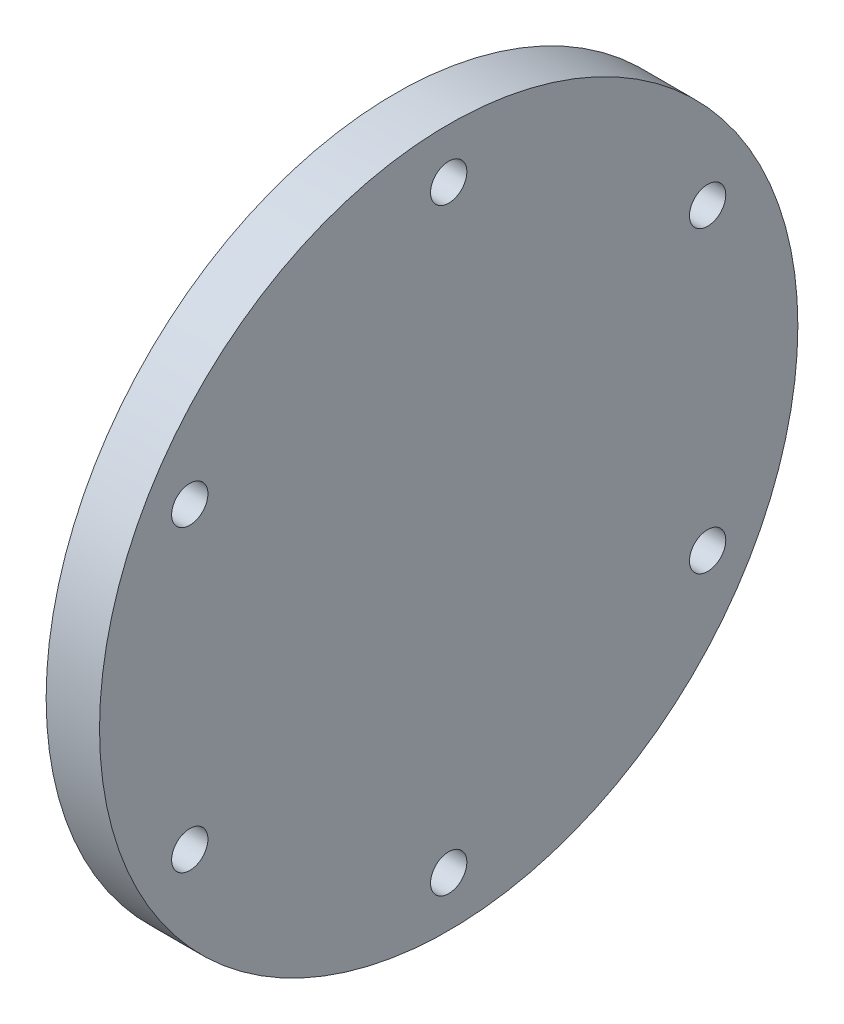
ISO-10303-21;
HEADER;
FILE_DESCRIPTION(('STEP AP214'),'2;1');
FILE_NAME('part.step','',(''),(''),'','','');
FILE_SCHEMA(('AUTOMOTIVE_DESIGN { 1 0 10303 214 1 1 1 1 }'));
ENDSEC;
DATA;
#1=APPLICATION_CONTEXT('core data for automotive mechanical design processes');
#2=APPLICATION_PROTOCOL_DEFINITION('international standard','automotive_design',2000,#1);
#3=PRODUCT_CONTEXT('',#1,'mechanical');
#4=PRODUCT('Part','Part','',(#3));
#5=PRODUCT_RELATED_PRODUCT_CATEGORY('part','',(#4));
#6=PRODUCT_DEFINITION_FORMATION('','',#4);
#7=PRODUCT_DEFINITION_CONTEXT('part definition',#1,'design');
#8=PRODUCT_DEFINITION('design','',#6,#7);
#9=PRODUCT_DEFINITION_SHAPE('','',#8);
#10=(LENGTH_UNIT() NAMED_UNIT(*) SI_UNIT(.MILLI.,.METRE.));
#11=(NAMED_UNIT(*) PLANE_ANGLE_UNIT() SI_UNIT($,.RADIAN.));
#12=(NAMED_UNIT(*) SI_UNIT($,.STERADIAN.) SOLID_ANGLE_UNIT());
#13=UNCERTAINTY_MEASURE_WITH_UNIT(LENGTH_MEASURE(1.E-05),#10,'distance_accuracy_value','');
#14=(GEOMETRIC_REPRESENTATION_CONTEXT(3) GLOBAL_UNCERTAINTY_ASSIGNED_CONTEXT((#13)) GLOBAL_UNIT_ASSIGNED_CONTEXT((#10,
#11,#12)) REPRESENTATION_CONTEXT('',''));
#15=CARTESIAN_POINT('',(0.,0.,0.));
#16=DIRECTION('',(0.,0.,1.));
#17=DIRECTION('',(1.,0.,0.));
#18=AXIS2_PLACEMENT_3D('',#15,#16,#17);
#19=CARTESIAN_POINT('',(5.,0.,0.));
#20=DIRECTION('',(-1.,0.,0.));
#21=DIRECTION('',(0.,0.,1.));
#22=AXIS2_PLACEMENT_3D('',#19,#20,#21);
#23=CYLINDRICAL_SURFACE('',#22,32.7);
#24=CARTESIAN_POINT('',(5.,0.,0.));
#25=DIRECTION('',(1.,0.,0.));
#26=DIRECTION('',(0.,0.,-1.));
#27=AXIS2_PLACEMENT_3D('',#24,#25,#26);
#28=CIRCLE('',#27,32.7);
#29=CARTESIAN_POINT('',(5.,0.,-32.7));
#30=VERTEX_POINT('',#29);
#31=EDGE_CURVE('E10',#30,#30,#28,.T.);
#32=ORIENTED_EDGE('',*,*,#31,.F.);
#33=EDGE_LOOP('',(#32));
#34=FACE_BOUND('',#33,.T.);
#35=CARTESIAN_POINT('',(0.,0.,0.));
#36=DIRECTION('',(1.,0.,0.));
#37=DIRECTION('',(0.,0.,-1.));
#38=AXIS2_PLACEMENT_3D('',#35,#36,#37);
#39=CIRCLE('',#38,32.7);
#40=CARTESIAN_POINT('',(0.,0.,-32.7));
#41=VERTEX_POINT('',#40);
#42=EDGE_CURVE('E37',#41,#41,#39,.T.);
#43=ORIENTED_EDGE('',*,*,#42,.T.);
#44=EDGE_LOOP('',(#43));
#45=FACE_BOUND('',#44,.T.);
#46=ADVANCED_FACE('F30',(#34,#45),#23,.T.);
#47=CARTESIAN_POINT('',(5.,0.,0.));
#48=DIRECTION('',(1.,0.,0.));
#49=DIRECTION('',(0.,0.,-1.));
#50=AXIS2_PLACEMENT_3D('',#47,#48,#49);
#51=PLANE('',#50);
#52=CARTESIAN_POINT('',(5.,28.,0.));
#53=DIRECTION('',(1.,0.,0.));
#54=DIRECTION('',(0.,0.,-1.));
#55=AXIS2_PLACEMENT_3D('',#52,#53,#54);
#56=CIRCLE('',#55,1.69999999999999);
#57=CARTESIAN_POINT('',(5.,28.,-1.69999999999999));
#58=VERTEX_POINT('',#57);
#59=EDGE_CURVE('E76',#58,#58,#56,.T.);
#60=ORIENTED_EDGE('',*,*,#59,.F.);
#61=EDGE_LOOP('',(#60));
#62=FACE_BOUND('',#61,.T.);
#63=CARTESIAN_POINT('',(5.,14.,-24.2487113059643));
#64=DIRECTION('',(1.,0.,0.));
#65=DIRECTION('',(0.,0.,-1.));
#66=AXIS2_PLACEMENT_3D('',#63,#64,#65);
#67=CIRCLE('',#66,1.69999999999999);
#68=CARTESIAN_POINT('',(5.,14.,-25.9487113059643));
#69=VERTEX_POINT('',#68);
#70=EDGE_CURVE('E70',#69,#69,#67,.T.);
#71=ORIENTED_EDGE('',*,*,#70,.F.);
#72=EDGE_LOOP('',(#71));
#73=FACE_BOUND('',#72,.T.);
#74=CARTESIAN_POINT('',(5.,-14.,-24.2487113059643));
#75=DIRECTION('',(1.,0.,0.));
#76=DIRECTION('',(0.,0.,-1.));
#77=AXIS2_PLACEMENT_3D('',#74,#75,#76);
#78=CIRCLE('',#77,1.69999999999999);
#79=CARTESIAN_POINT('',(5.,-14.,-25.9487113059643));
#80=VERTEX_POINT('',#79);
#81=EDGE_CURVE('E64',#80,#80,#78,.T.);
#82=ORIENTED_EDGE('',*,*,#81,.F.);
#83=EDGE_LOOP('',(#82));
#84=FACE_BOUND('',#83,.T.);
#85=CARTESIAN_POINT('',(5.,-28.,0.));
#86=DIRECTION('',(1.,0.,0.));
#87=DIRECTION('',(0.,0.,-1.));
#88=AXIS2_PLACEMENT_3D('',#85,#86,#87);
#89=CIRCLE('',#88,1.69999999999999);
#90=CARTESIAN_POINT('',(5.,-28.,-1.69999999999999));
#91=VERTEX_POINT('',#90);
#92=EDGE_CURVE('E59',#91,#91,#89,.T.);
#93=ORIENTED_EDGE('',*,*,#92,.F.);
#94=EDGE_LOOP('',(#93));
#95=FACE_BOUND('',#94,.T.);
#96=CARTESIAN_POINT('',(5.,-14.,24.2487113059643));
#97=DIRECTION('',(1.,0.,0.));
#98=DIRECTION('',(0.,0.,-1.));
#99=AXIS2_PLACEMENT_3D('',#96,#97,#98);
#100=CIRCLE('',#99,1.69999999999999);
#101=CARTESIAN_POINT('',(5.,-14.,22.5487113059643));
#102=VERTEX_POINT('',#101);
#103=EDGE_CURVE('E49',#102,#102,#100,.T.);
#104=ORIENTED_EDGE('',*,*,#103,.F.);
#105=EDGE_LOOP('',(#104));
#106=FACE_BOUND('',#105,.T.);
#107=CARTESIAN_POINT('',(5.,14.,24.2487113059643));
#108=DIRECTION('',(1.,0.,0.));
#109=DIRECTION('',(0.,0.,-1.));
#110=AXIS2_PLACEMENT_3D('',#107,#108,#109);
#111=CIRCLE('',#110,1.69999999999999);
#112=CARTESIAN_POINT('',(5.,14.,22.5487113059643));
#113=VERTEX_POINT('',#112);
#114=EDGE_CURVE('E48',#113,#113,#111,.T.);
#115=ORIENTED_EDGE('',*,*,#114,.F.);
#116=EDGE_LOOP('',(#115));
#117=FACE_BOUND('',#116,.T.);
#118=ORIENTED_EDGE('',*,*,#31,.T.);
#119=EDGE_LOOP('',(#118));
#120=FACE_BOUND('',#119,.T.);
#121=ADVANCED_FACE('F83',(#62,#73,#84,#95,#106,#117,#120),#51,.T.);
#122=CARTESIAN_POINT('',(0.,0.,0.));
#123=DIRECTION('',(1.,0.,0.));
#124=DIRECTION('',(0.,0.,-1.));
#125=AXIS2_PLACEMENT_3D('',#122,#123,#124);
#126=PLANE('',#125);
#127=CARTESIAN_POINT('',(0.,28.,0.));
#128=DIRECTION('',(1.,0.,0.));
#129=DIRECTION('',(0.,0.,-1.));
#130=AXIS2_PLACEMENT_3D('',#127,#128,#129);
#131=CIRCLE('',#130,1.69999999999999);
#132=CARTESIAN_POINT('',(0.,28.,-1.69999999999999));
#133=VERTEX_POINT('',#132);
#134=EDGE_CURVE('E73',#133,#133,#131,.T.);
#135=ORIENTED_EDGE('',*,*,#134,.T.);
#136=EDGE_LOOP('',(#135));
#137=FACE_BOUND('',#136,.T.);
#138=CARTESIAN_POINT('',(0.,14.,-24.2487113059643));
#139=DIRECTION('',(1.,0.,0.));
#140=DIRECTION('',(0.,0.,-1.));
#141=AXIS2_PLACEMENT_3D('',#138,#139,#140);
#142=CIRCLE('',#141,1.69999999999999);
#143=CARTESIAN_POINT('',(0.,14.,-25.9487113059643));
#144=VERTEX_POINT('',#143);
#145=EDGE_CURVE('E67',#144,#144,#142,.T.);
#146=ORIENTED_EDGE('',*,*,#145,.T.);
#147=EDGE_LOOP('',(#146));
#148=FACE_BOUND('',#147,.T.);
#149=CARTESIAN_POINT('',(0.,-14.,-24.2487113059643));
#150=DIRECTION('',(1.,0.,0.));
#151=DIRECTION('',(0.,0.,-1.));
#152=AXIS2_PLACEMENT_3D('',#149,#150,#151);
#153=CIRCLE('',#152,1.69999999999999);
#154=CARTESIAN_POINT('',(0.,-14.,-25.9487113059643));
#155=VERTEX_POINT('',#154);
#156=EDGE_CURVE('E33',#155,#155,#153,.T.);
#157=ORIENTED_EDGE('',*,*,#156,.T.);
#158=EDGE_LOOP('',(#157));
#159=FACE_BOUND('',#158,.T.);
#160=CARTESIAN_POINT('',(0.,-28.,0.));
#161=DIRECTION('',(1.,0.,0.));
#162=DIRECTION('',(0.,0.,-1.));
#163=AXIS2_PLACEMENT_3D('',#160,#161,#162);
#164=CIRCLE('',#163,1.69999999999999);
#165=CARTESIAN_POINT('',(0.,-28.,-1.69999999999999));
#166=VERTEX_POINT('',#165);
#167=EDGE_CURVE('E54',#166,#166,#164,.T.);
#168=ORIENTED_EDGE('',*,*,#167,.T.);
#169=EDGE_LOOP('',(#168));
#170=FACE_BOUND('',#169,.T.);
#171=CARTESIAN_POINT('',(0.,-14.,24.2487113059643));
#172=DIRECTION('',(1.,0.,0.));
#173=DIRECTION('',(0.,0.,-1.));
#174=AXIS2_PLACEMENT_3D('',#171,#172,#173);
#175=CIRCLE('',#174,1.69999999999999);
#176=CARTESIAN_POINT('',(0.,-14.,22.5487113059643));
#177=VERTEX_POINT('',#176);
#178=EDGE_CURVE('E46',#177,#177,#175,.T.);
#179=ORIENTED_EDGE('',*,*,#178,.T.);
#180=EDGE_LOOP('',(#179));
#181=FACE_BOUND('',#180,.T.);
#182=CARTESIAN_POINT('',(0.,14.,24.2487113059643));
#183=DIRECTION('',(1.,0.,0.));
#184=DIRECTION('',(0.,0.,-1.));
#185=AXIS2_PLACEMENT_3D('',#182,#183,#184);
#186=CIRCLE('',#185,1.69999999999999);
#187=CARTESIAN_POINT('',(0.,14.,22.5487113059643));
#188=VERTEX_POINT('',#187);
#189=EDGE_CURVE('E42',#188,#188,#186,.T.);
#190=ORIENTED_EDGE('',*,*,#189,.T.);
#191=EDGE_LOOP('',(#190));
#192=FACE_BOUND('',#191,.T.);
#193=ORIENTED_EDGE('',*,*,#42,.F.);
#194=EDGE_LOOP('',(#193));
#195=FACE_BOUND('',#194,.T.);
#196=ADVANCED_FACE('F86',(#137,#148,#159,#170,#181,#192,#195),#126,.F.);
#197=CARTESIAN_POINT('',(5.,14.,24.2487113059643));
#198=DIRECTION('',(1.,0.,0.));
#199=DIRECTION('',(0.,0.,-1.));
#200=AXIS2_PLACEMENT_3D('',#197,#198,#199);
#201=CYLINDRICAL_SURFACE('',#200,1.69999999999999);
#202=ORIENTED_EDGE('',*,*,#114,.T.);
#203=EDGE_LOOP('',(#202));
#204=FACE_BOUND('',#203,.T.);
#205=ORIENTED_EDGE('',*,*,#189,.F.);
#206=EDGE_LOOP('',(#205));
#207=FACE_BOUND('',#206,.T.);
#208=ADVANCED_FACE('F97',(#204,#207),#201,.F.);
#209=CARTESIAN_POINT('',(5.,-14.,24.2487113059643));
#210=DIRECTION('',(1.,0.,0.));
#211=DIRECTION('',(0.,0.,-1.));
#212=AXIS2_PLACEMENT_3D('',#209,#210,#211);
#213=CYLINDRICAL_SURFACE('',#212,1.69999999999999);
#214=ORIENTED_EDGE('',*,*,#103,.T.);
#215=EDGE_LOOP('',(#214));
#216=FACE_BOUND('',#215,.T.);
#217=ORIENTED_EDGE('',*,*,#178,.F.);
#218=EDGE_LOOP('',(#217));
#219=FACE_BOUND('',#218,.T.);
#220=ADVANCED_FACE('F100',(#216,#219),#213,.F.);
#221=CARTESIAN_POINT('',(5.,-28.,0.));
#222=DIRECTION('',(1.,0.,0.));
#223=DIRECTION('',(0.,0.,-1.));
#224=AXIS2_PLACEMENT_3D('',#221,#222,#223);
#225=CYLINDRICAL_SURFACE('',#224,1.69999999999999);
#226=ORIENTED_EDGE('',*,*,#92,.T.);
#227=EDGE_LOOP('',(#226));
#228=FACE_BOUND('',#227,.T.);
#229=ORIENTED_EDGE('',*,*,#167,.F.);
#230=EDGE_LOOP('',(#229));
#231=FACE_BOUND('',#230,.T.);
#232=ADVANCED_FACE('F132',(#228,#231),#225,.F.);
#233=CARTESIAN_POINT('',(5.,-14.,-24.2487113059643));
#234=DIRECTION('',(1.,0.,0.));
#235=DIRECTION('',(0.,0.,-1.));
#236=AXIS2_PLACEMENT_3D('',#233,#234,#235);
#237=CYLINDRICAL_SURFACE('',#236,1.69999999999999);
#238=ORIENTED_EDGE('',*,*,#81,.T.);
#239=EDGE_LOOP('',(#238));
#240=FACE_BOUND('',#239,.T.);
#241=ORIENTED_EDGE('',*,*,#156,.F.);
#242=EDGE_LOOP('',(#241));
#243=FACE_BOUND('',#242,.T.);
#244=ADVANCED_FACE('F139',(#240,#243),#237,.F.);
#245=CARTESIAN_POINT('',(5.,14.,-24.2487113059643));
#246=DIRECTION('',(1.,0.,0.));
#247=DIRECTION('',(0.,0.,-1.));
#248=AXIS2_PLACEMENT_3D('',#245,#246,#247);
#249=CYLINDRICAL_SURFACE('',#248,1.69999999999999);
#250=ORIENTED_EDGE('',*,*,#70,.T.);
#251=EDGE_LOOP('',(#250));
#252=FACE_BOUND('',#251,.T.);
#253=ORIENTED_EDGE('',*,*,#145,.F.);
#254=EDGE_LOOP('',(#253));
#255=FACE_BOUND('',#254,.T.);
#256=ADVANCED_FACE('F147',(#252,#255),#249,.F.);
#257=CARTESIAN_POINT('',(5.,28.,0.));
#258=DIRECTION('',(1.,0.,0.));
#259=DIRECTION('',(0.,0.,-1.));
#260=AXIS2_PLACEMENT_3D('',#257,#258,#259);
#261=CYLINDRICAL_SURFACE('',#260,1.69999999999999);
#262=ORIENTED_EDGE('',*,*,#59,.T.);
#263=EDGE_LOOP('',(#262));
#264=FACE_BOUND('',#263,.T.);
#265=ORIENTED_EDGE('',*,*,#134,.F.);
#266=EDGE_LOOP('',(#265));
#267=FACE_BOUND('',#266,.T.);
#268=ADVANCED_FACE('F80',(#264,#267),#261,.F.);
#269=CLOSED_SHELL('',(#46,#121,#196,#208,#220,#232,#244,#256,#268));
#270=MANIFOLD_SOLID_BREP('B2',#269);
#271=ADVANCED_BREP_SHAPE_REPRESENTATION('',(#18,#270),#14);
#272=SHAPE_DEFINITION_REPRESENTATION(#9,#271);
ENDSEC;
END-ISO-10303-21;
